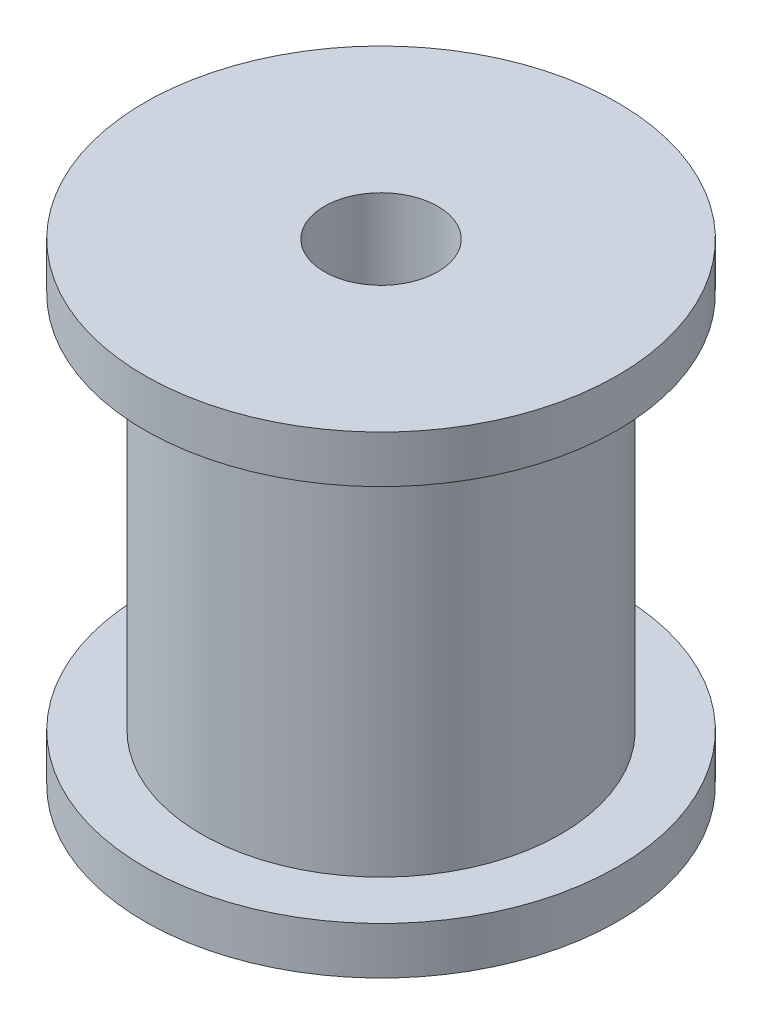
ISO-10303-21;
HEADER;
FILE_DESCRIPTION(('STEP AP214'),'2;1');
FILE_NAME('part.step','',(''),(''),'','','');
FILE_SCHEMA(('AUTOMOTIVE_DESIGN { 1 0 10303 214 1 1 1 1 }'));
ENDSEC;
DATA;
#1=APPLICATION_CONTEXT('core data for automotive mechanical design processes');
#2=APPLICATION_PROTOCOL_DEFINITION('international standard','automotive_design',2000,#1);
#3=PRODUCT_CONTEXT('',#1,'mechanical');
#4=PRODUCT('Part','Part','',(#3));
#5=PRODUCT_RELATED_PRODUCT_CATEGORY('part','',(#4));
#6=PRODUCT_DEFINITION_FORMATION('','',#4);
#7=PRODUCT_DEFINITION_CONTEXT('part definition',#1,'design');
#8=PRODUCT_DEFINITION('design','',#6,#7);
#9=PRODUCT_DEFINITION_SHAPE('','',#8);
#10=(LENGTH_UNIT() NAMED_UNIT(*) SI_UNIT(.MILLI.,.METRE.));
#11=(NAMED_UNIT(*) PLANE_ANGLE_UNIT() SI_UNIT($,.RADIAN.));
#12=(NAMED_UNIT(*) SI_UNIT($,.STERADIAN.) SOLID_ANGLE_UNIT());
#13=UNCERTAINTY_MEASURE_WITH_UNIT(LENGTH_MEASURE(1.E-05),#10,'distance_accuracy_value','');
#14=(GEOMETRIC_REPRESENTATION_CONTEXT(3) GLOBAL_UNCERTAINTY_ASSIGNED_CONTEXT((#13)) GLOBAL_UNIT_ASSIGNED_CONTEXT((#10,
#11,#12)) REPRESENTATION_CONTEXT('',''));
#15=CARTESIAN_POINT('',(0.,0.,0.));
#16=DIRECTION('',(0.,0.,1.));
#17=DIRECTION('',(1.,0.,0.));
#18=AXIS2_PLACEMENT_3D('',#15,#16,#17);
#19=CARTESIAN_POINT('',(3.,12.5,0.));
#20=DIRECTION('',(0.,1.,0.));
#21=DIRECTION('',(-1.,0.,0.));
#22=AXIS2_PLACEMENT_3D('',#19,#20,#21);
#23=PLANE('',#22);
#24=CARTESIAN_POINT('',(0.,12.5,0.));
#25=DIRECTION('',(0.,-1.,0.));
#26=DIRECTION('',(1.,0.,0.));
#27=AXIS2_PLACEMENT_3D('',#24,#25,#26);
#28=CIRCLE('',#27,3.00000000000004);
#29=CARTESIAN_POINT('',(3.,12.5,0.));
#30=VERTEX_POINT('',#29);
#31=EDGE_CURVE('E77',#30,#30,#28,.T.);
#32=ORIENTED_EDGE('',*,*,#31,.T.);
#33=EDGE_LOOP('',(#32));
#34=FACE_BOUND('',#33,.T.);
#35=CARTESIAN_POINT('',(0.,12.5,0.));
#36=DIRECTION('',(0.,-1.,0.));
#37=DIRECTION('',(1.,0.,0.));
#38=AXIS2_PLACEMENT_3D('',#35,#36,#37);
#39=CIRCLE('',#38,12.5);
#40=CARTESIAN_POINT('',(12.5,12.5,0.));
#41=VERTEX_POINT('',#40);
#42=EDGE_CURVE('E10',#41,#41,#39,.T.);
#43=ORIENTED_EDGE('',*,*,#42,.F.);
#44=EDGE_LOOP('',(#43));
#45=FACE_BOUND('',#44,.T.);
#46=ADVANCED_FACE('F42',(#34,#45),#23,.T.);
#47=CARTESIAN_POINT('',(7.53741618361403E-13,-219.733791513747,0.));
#48=DIRECTION('',(0.,-1.,0.));
#49=DIRECTION('',(1.,0.,0.));
#50=AXIS2_PLACEMENT_3D('',#47,#48,#49);
#51=CYLINDRICAL_SURFACE('',#50,12.5);
#52=ORIENTED_EDGE('',*,*,#42,.T.);
#53=EDGE_LOOP('',(#52));
#54=FACE_BOUND('',#53,.T.);
#55=CARTESIAN_POINT('',(0.,9.99999999999995,0.));
#56=DIRECTION('',(0.,-1.,0.));
#57=DIRECTION('',(1.,0.,0.));
#58=AXIS2_PLACEMENT_3D('',#55,#56,#57);
#59=CIRCLE('',#58,12.5);
#60=CARTESIAN_POINT('',(12.5,10.,0.));
#61=VERTEX_POINT('',#60);
#62=EDGE_CURVE('E49',#61,#61,#59,.T.);
#63=ORIENTED_EDGE('',*,*,#62,.F.);
#64=EDGE_LOOP('',(#63));
#65=FACE_BOUND('',#64,.T.);
#66=ADVANCED_FACE('F96',(#54,#65),#51,.T.);
#67=CARTESIAN_POINT('',(12.5,10.,0.));
#68=DIRECTION('',(0.,-1.,0.));
#69=DIRECTION('',(1.,0.,0.));
#70=AXIS2_PLACEMENT_3D('',#67,#68,#69);
#71=PLANE('',#70);
#72=ORIENTED_EDGE('',*,*,#62,.T.);
#73=EDGE_LOOP('',(#72));
#74=FACE_BOUND('',#73,.T.);
#75=CARTESIAN_POINT('',(0.,9.99999999999998,0.));
#76=DIRECTION('',(0.,-1.,0.));
#77=DIRECTION('',(1.,0.,0.));
#78=AXIS2_PLACEMENT_3D('',#75,#76,#77);
#79=CIRCLE('',#78,9.50000000000003);
#80=CARTESIAN_POINT('',(9.5,10.,0.));
#81=VERTEX_POINT('',#80);
#82=EDGE_CURVE('E54',#81,#81,#79,.T.);
#83=ORIENTED_EDGE('',*,*,#82,.F.);
#84=EDGE_LOOP('',(#83));
#85=FACE_BOUND('',#84,.T.);
#86=ADVANCED_FACE('F100',(#74,#85),#71,.T.);
#87=CARTESIAN_POINT('',(7.53741618361403E-13,-219.733791513747,0.));
#88=DIRECTION('',(0.,-1.,0.));
#89=DIRECTION('',(1.,0.,0.));
#90=AXIS2_PLACEMENT_3D('',#87,#88,#89);
#91=CYLINDRICAL_SURFACE('',#90,9.5);
#92=ORIENTED_EDGE('',*,*,#82,.T.);
#93=EDGE_LOOP('',(#92));
#94=FACE_BOUND('',#93,.T.);
#95=CARTESIAN_POINT('',(0.,-10.,0.));
#96=DIRECTION('',(0.,-1.,0.));
#97=DIRECTION('',(1.,0.,0.));
#98=AXIS2_PLACEMENT_3D('',#95,#96,#97);
#99=CIRCLE('',#98,9.49999999999996);
#100=CARTESIAN_POINT('',(9.5,-10.,0.));
#101=VERTEX_POINT('',#100);
#102=EDGE_CURVE('E59',#101,#101,#99,.T.);
#103=ORIENTED_EDGE('',*,*,#102,.F.);
#104=EDGE_LOOP('',(#103));
#105=FACE_BOUND('',#104,.T.);
#106=ADVANCED_FACE('F104',(#94,#105),#91,.T.);
#107=CARTESIAN_POINT('',(12.5,-10.,0.));
#108=DIRECTION('',(0.,1.,0.));
#109=DIRECTION('',(-1.,0.,0.));
#110=AXIS2_PLACEMENT_3D('',#107,#108,#109);
#111=PLANE('',#110);
#112=ORIENTED_EDGE('',*,*,#102,.T.);
#113=EDGE_LOOP('',(#112));
#114=FACE_BOUND('',#113,.T.);
#115=CARTESIAN_POINT('',(0.,-10.0000000000001,0.));
#116=DIRECTION('',(0.,-1.,0.));
#117=DIRECTION('',(1.,0.,0.));
#118=AXIS2_PLACEMENT_3D('',#115,#116,#117);
#119=CIRCLE('',#118,12.5);
#120=CARTESIAN_POINT('',(12.5,-10.,0.));
#121=VERTEX_POINT('',#120);
#122=EDGE_CURVE('E65',#121,#121,#119,.T.);
#123=ORIENTED_EDGE('',*,*,#122,.F.);
#124=EDGE_LOOP('',(#123));
#125=FACE_BOUND('',#124,.T.);
#126=ADVANCED_FACE('F110',(#114,#125),#111,.T.);
#127=CARTESIAN_POINT('',(7.53741618361403E-13,-219.733791513747,0.));
#128=DIRECTION('',(0.,-1.,0.));
#129=DIRECTION('',(1.,0.,0.));
#130=AXIS2_PLACEMENT_3D('',#127,#128,#129);
#131=CYLINDRICAL_SURFACE('',#130,12.5);
#132=ORIENTED_EDGE('',*,*,#122,.T.);
#133=EDGE_LOOP('',(#132));
#134=FACE_BOUND('',#133,.T.);
#135=CARTESIAN_POINT('',(0.,-12.5000000000001,0.));
#136=DIRECTION('',(0.,-1.,0.));
#137=DIRECTION('',(1.,0.,0.));
#138=AXIS2_PLACEMENT_3D('',#135,#136,#137);
#139=CIRCLE('',#138,12.5);
#140=CARTESIAN_POINT('',(12.5,-12.5,0.));
#141=VERTEX_POINT('',#140);
#142=EDGE_CURVE('E69',#141,#141,#139,.T.);
#143=ORIENTED_EDGE('',*,*,#142,.F.);
#144=EDGE_LOOP('',(#143));
#145=FACE_BOUND('',#144,.T.);
#146=ADVANCED_FACE('F92',(#134,#145),#131,.T.);
#147=CARTESIAN_POINT('',(3.,-12.5,0.));
#148=DIRECTION('',(0.,-1.,0.));
#149=DIRECTION('',(1.,0.,0.));
#150=AXIS2_PLACEMENT_3D('',#147,#148,#149);
#151=PLANE('',#150);
#152=ORIENTED_EDGE('',*,*,#142,.T.);
#153=EDGE_LOOP('',(#152));
#154=FACE_BOUND('',#153,.T.);
#155=CARTESIAN_POINT('',(0.,-12.5,0.));
#156=DIRECTION('',(0.,-1.,0.));
#157=DIRECTION('',(1.,0.,0.));
#158=AXIS2_PLACEMENT_3D('',#155,#156,#157);
#159=CIRCLE('',#158,2.99999999999996);
#160=CARTESIAN_POINT('',(3.,-12.5,0.));
#161=VERTEX_POINT('',#160);
#162=EDGE_CURVE('E73',#161,#161,#159,.T.);
#163=ORIENTED_EDGE('',*,*,#162,.F.);
#164=EDGE_LOOP('',(#163));
#165=FACE_BOUND('',#164,.T.);
#166=ADVANCED_FACE('F86',(#154,#165),#151,.T.);
#167=CARTESIAN_POINT('',(7.53741618361403E-13,-219.733791513747,0.));
#168=DIRECTION('',(0.,-1.,0.));
#169=DIRECTION('',(1.,0.,0.));
#170=AXIS2_PLACEMENT_3D('',#167,#168,#169);
#171=CYLINDRICAL_SURFACE('',#170,3.);
#172=ORIENTED_EDGE('',*,*,#162,.T.);
#173=EDGE_LOOP('',(#172));
#174=FACE_BOUND('',#173,.T.);
#175=ORIENTED_EDGE('',*,*,#31,.F.);
#176=EDGE_LOOP('',(#175));
#177=FACE_BOUND('',#176,.T.);
#178=ADVANCED_FACE('F84',(#174,#177),#171,.F.);
#179=CLOSED_SHELL('',(#46,#66,#86,#106,#126,#146,#166,#178));
#180=MANIFOLD_SOLID_BREP('B2',#179);
#181=ADVANCED_BREP_SHAPE_REPRESENTATION('',(#18,#180),#14);
#182=SHAPE_DEFINITION_REPRESENTATION(#9,#181);
ENDSEC;
END-ISO-10303-21;
